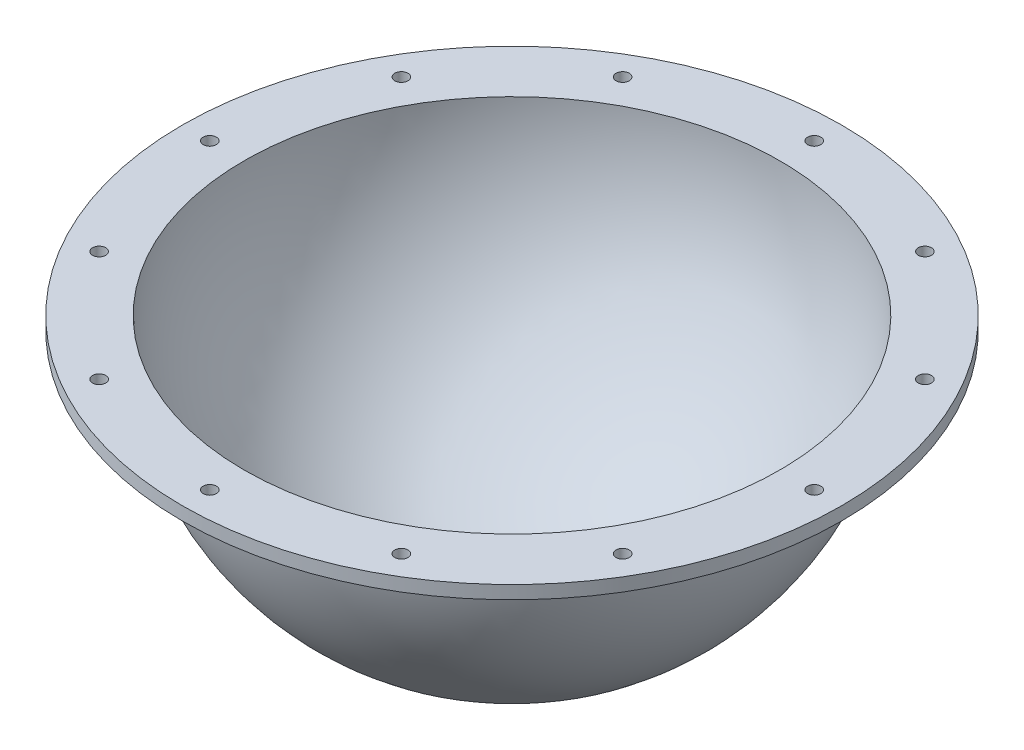
ISO-10303-21;
HEADER;
FILE_DESCRIPTION(('STEP AP214'),'2;1');
FILE_NAME('part.step','',(''),(''),'','','');
FILE_SCHEMA(('AUTOMOTIVE_DESIGN { 1 0 10303 214 1 1 1 1 }'));
ENDSEC;
DATA;
#1=APPLICATION_CONTEXT('core data for automotive mechanical design processes');
#2=APPLICATION_PROTOCOL_DEFINITION('international standard','automotive_design',2000,#1);
#3=PRODUCT_CONTEXT('',#1,'mechanical');
#4=PRODUCT('Part','Part','',(#3));
#5=PRODUCT_RELATED_PRODUCT_CATEGORY('part','',(#4));
#6=PRODUCT_DEFINITION_FORMATION('','',#4);
#7=PRODUCT_DEFINITION_CONTEXT('part definition',#1,'design');
#8=PRODUCT_DEFINITION('design','',#6,#7);
#9=PRODUCT_DEFINITION_SHAPE('','',#8);
#10=(LENGTH_UNIT() NAMED_UNIT(*) SI_UNIT(.MILLI.,.METRE.));
#11=(NAMED_UNIT(*) PLANE_ANGLE_UNIT() SI_UNIT($,.RADIAN.));
#12=(NAMED_UNIT(*) SI_UNIT($,.STERADIAN.) SOLID_ANGLE_UNIT());
#13=UNCERTAINTY_MEASURE_WITH_UNIT(LENGTH_MEASURE(1.E-05),#10,'distance_accuracy_value','');
#14=(GEOMETRIC_REPRESENTATION_CONTEXT(3) GLOBAL_UNCERTAINTY_ASSIGNED_CONTEXT((#13)) GLOBAL_UNIT_ASSIGNED_CONTEXT((#10,
#11,#12)) REPRESENTATION_CONTEXT('',''));
#15=CARTESIAN_POINT('',(0.,0.,0.));
#16=DIRECTION('',(0.,0.,1.));
#17=DIRECTION('',(1.,0.,0.));
#18=AXIS2_PLACEMENT_3D('',#15,#16,#17);
#19=CARTESIAN_POINT('',(1.59204083889156E-13,0.,0.));
#20=DIRECTION('',(0.,0.,-1.));
#21=DIRECTION('',(-1.,0.,0.));
#22=AXIS2_PLACEMENT_3D('',#19,#20,#21);
#23=SPHERICAL_SURFACE('',#22,243.75);
#24=CARTESIAN_POINT('',(1.59204083889156E-13,0.,0.));
#25=DIRECTION('',(0.,1.,0.));
#26=DIRECTION('',(0.,0.,1.));
#27=AXIS2_PLACEMENT_3D('',#24,#25,#26);
#28=SPHERICAL_SURFACE('',#27,243.75);
#29=CARTESIAN_POINT('',(1.59204083889156E-13,0.,0.));
#30=DIRECTION('',(0.,1.,0.));
#31=DIRECTION('',(0.,0.,1.));
#32=AXIS2_PLACEMENT_3D('',#29,#30,#31);
#33=CIRCLE('',#32,243.75);
#34=CARTESIAN_POINT('',(1.59204083889156E-13,0.,243.75));
#35=VERTEX_POINT('',#34);
#36=EDGE_CURVE('E10',#35,#35,#33,.T.);
#37=ORIENTED_EDGE('',*,*,#36,.T.);
#38=EDGE_LOOP('',(#37));
#39=FACE_BOUND('',#38,.T.);
#40=ADVANCED_FACE('F30',(#39),#28,.F.);
#41=CARTESIAN_POINT('',(1.59204083889156E-13,0.,0.));
#42=DIRECTION('',(0.,-1.,0.));
#43=DIRECTION('',(0.,0.,1.));
#44=AXIS2_PLACEMENT_3D('',#41,#42,#43);
#45=PLANE('',#44);
#46=CARTESIAN_POINT('',(0.,0.,-275.));
#47=DIRECTION('',(0.,1.,0.));
#48=DIRECTION('',(-1.,0.,0.));
#49=AXIS2_PLACEMENT_3D('',#46,#47,#48);
#50=CIRCLE('',#49,6.00000000000001);
#51=CARTESIAN_POINT('',(-6.00000000000001,0.,-275.));
#52=VERTEX_POINT('',#51);
#53=EDGE_CURVE('E51',#52,#52,#50,.T.);
#54=ORIENTED_EDGE('',*,*,#53,.F.);
#55=EDGE_LOOP('',(#54));
#56=FACE_BOUND('',#55,.T.);
#57=CARTESIAN_POINT('',(137.500000000001,9.60157368181865E-13,-238.156986040721));
#58=DIRECTION('',(0.,1.,0.));
#59=DIRECTION('',(-1.,0.,0.));
#60=AXIS2_PLACEMENT_3D('',#57,#58,#59);
#61=CIRCLE('',#60,6.00000000000002);
#62=CARTESIAN_POINT('',(131.500000000001,9.18259592115748E-13,-238.156986040721));
#63=VERTEX_POINT('',#62);
#64=EDGE_CURVE('E116',#63,#63,#61,.T.);
#65=ORIENTED_EDGE('',*,*,#64,.F.);
#66=EDGE_LOOP('',(#65));
#67=FACE_BOUND('',#66,.T.);
#68=CARTESIAN_POINT('',(238.156986040721,1.66304134495261E-12,-137.5));
#69=DIRECTION('',(0.,1.,0.));
#70=DIRECTION('',(-1.,0.,0.));
#71=AXIS2_PLACEMENT_3D('',#68,#69,#70);
#72=CIRCLE('',#71,5.99999999999999);
#73=CARTESIAN_POINT('',(232.156986040721,1.62114356888649E-12,-137.5));
#74=VERTEX_POINT('',#73);
#75=EDGE_CURVE('E119',#74,#74,#72,.T.);
#76=ORIENTED_EDGE('',*,*,#75,.F.);
#77=EDGE_LOOP('',(#76));
#78=FACE_BOUND('',#77,.T.);
#79=CARTESIAN_POINT('',(275.000000000001,1.92031473636373E-12,5.45708531560709E-13));
#80=DIRECTION('',(0.,1.,0.));
#81=DIRECTION('',(-1.,0.,0.));
#82=AXIS2_PLACEMENT_3D('',#79,#80,#81);
#83=CIRCLE('',#82,5.99999999999999);
#84=CARTESIAN_POINT('',(269.000000000001,1.87841696029761E-12,5.45708531560709E-13));
#85=VERTEX_POINT('',#84);
#86=EDGE_CURVE('E108',#85,#85,#83,.T.);
#87=ORIENTED_EDGE('',*,*,#86,.F.);
#88=EDGE_LOOP('',(#87));
#89=FACE_BOUND('',#88,.T.);
#90=CARTESIAN_POINT('',(-137.5,-9.60157368181864E-13,-238.156986040721));
#91=DIRECTION('',(0.,1.,0.));
#92=DIRECTION('',(-1.,0.,0.));
#93=AXIS2_PLACEMENT_3D('',#90,#91,#92);
#94=CIRCLE('',#93,5.99999999999999);
#95=CARTESIAN_POINT('',(-143.5,-1.00205514424798E-12,-238.156986040721));
#96=VERTEX_POINT('',#95);
#97=EDGE_CURVE('E101',#96,#96,#94,.T.);
#98=ORIENTED_EDGE('',*,*,#97,.F.);
#99=EDGE_LOOP('',(#98));
#100=FACE_BOUND('',#99,.T.);
#101=CARTESIAN_POINT('',(-238.156986040721,-1.6630413449526E-12,-137.5));
#102=DIRECTION('',(0.,1.,0.));
#103=DIRECTION('',(-1.,0.,0.));
#104=AXIS2_PLACEMENT_3D('',#101,#102,#103);
#105=CIRCLE('',#104,5.99999999999999);
#106=CARTESIAN_POINT('',(-244.156986040721,-1.70493912101872E-12,-137.5));
#107=VERTEX_POINT('',#106);
#108=EDGE_CURVE('E98',#107,#107,#105,.T.);
#109=ORIENTED_EDGE('',*,*,#108,.F.);
#110=EDGE_LOOP('',(#109));
#111=FACE_BOUND('',#110,.T.);
#112=CARTESIAN_POINT('',(-275.000000000001,-1.92031473636373E-12,6.67177904429211E-13));
#113=DIRECTION('',(0.,1.,0.));
#114=DIRECTION('',(-1.,0.,0.));
#115=AXIS2_PLACEMENT_3D('',#112,#113,#114);
#116=CIRCLE('',#115,5.99999999999999);
#117=CARTESIAN_POINT('',(-281.000000000001,-1.96221251242984E-12,6.67177904429211E-13));
#118=VERTEX_POINT('',#117);
#119=EDGE_CURVE('E94',#118,#118,#116,.T.);
#120=ORIENTED_EDGE('',*,*,#119,.F.);
#121=EDGE_LOOP('',(#120));
#122=FACE_BOUND('',#121,.T.);
#123=CARTESIAN_POINT('',(-238.156986040721,-1.6630413449526E-12,137.500000000001));
#124=DIRECTION('',(0.,1.,0.));
#125=DIRECTION('',(-1.,0.,0.));
#126=AXIS2_PLACEMENT_3D('',#123,#124,#125);
#127=CIRCLE('',#126,5.99999999999999);
#128=CARTESIAN_POINT('',(-244.156986040721,-1.70493912101872E-12,137.500000000001));
#129=VERTEX_POINT('',#128);
#130=EDGE_CURVE('E91',#129,#129,#127,.T.);
#131=ORIENTED_EDGE('',*,*,#130,.F.);
#132=EDGE_LOOP('',(#131));
#133=FACE_BOUND('',#132,.T.);
#134=CARTESIAN_POINT('',(-137.5,-9.60157368181863E-13,238.156986040722));
#135=DIRECTION('',(0.,1.,0.));
#136=DIRECTION('',(-1.,0.,0.));
#137=AXIS2_PLACEMENT_3D('',#134,#135,#136);
#138=CIRCLE('',#137,6.00000000000007);
#139=CARTESIAN_POINT('',(-143.5,-1.00205514424798E-12,238.156986040722));
#140=VERTEX_POINT('',#139);
#141=EDGE_CURVE('E95',#140,#140,#138,.T.);
#142=ORIENTED_EDGE('',*,*,#141,.F.);
#143=EDGE_LOOP('',(#142));
#144=FACE_BOUND('',#143,.T.);
#145=CARTESIAN_POINT('',(1.55147159845054E-13,0.,275.000000000001));
#146=DIRECTION('',(0.,1.,0.));
#147=DIRECTION('',(-1.,0.,0.));
#148=AXIS2_PLACEMENT_3D('',#145,#146,#147);
#149=CIRCLE('',#148,6.00000000000001);
#150=CARTESIAN_POINT('',(-5.99999999999985,0.,275.000000000001));
#151=VERTEX_POINT('',#150);
#152=EDGE_CURVE('E111',#151,#151,#149,.T.);
#153=ORIENTED_EDGE('',*,*,#152,.F.);
#154=EDGE_LOOP('',(#153));
#155=FACE_BOUND('',#154,.T.);
#156=CARTESIAN_POINT('',(137.5,9.60157368181864E-13,238.156986040722));
#157=DIRECTION('',(0.,1.,0.));
#158=DIRECTION('',(-1.,0.,0.));
#159=AXIS2_PLACEMENT_3D('',#156,#157,#158);
#160=CIRCLE('',#159,5.99999999999999);
#161=CARTESIAN_POINT('',(131.5,9.18259592115747E-13,238.156986040722));
#162=VERTEX_POINT('',#161);
#163=EDGE_CURVE('E107',#162,#162,#160,.T.);
#164=ORIENTED_EDGE('',*,*,#163,.F.);
#165=EDGE_LOOP('',(#164));
#166=FACE_BOUND('',#165,.T.);
#167=CARTESIAN_POINT('',(238.156986040721,1.66304134495261E-12,137.500000000001));
#168=DIRECTION('',(0.,1.,0.));
#169=DIRECTION('',(-1.,0.,0.));
#170=AXIS2_PLACEMENT_3D('',#167,#168,#169);
#171=CIRCLE('',#170,5.99999999999999);
#172=CARTESIAN_POINT('',(232.156986040721,1.62114356888649E-12,137.500000000001));
#173=VERTEX_POINT('',#172);
#174=EDGE_CURVE('E104',#173,#173,#171,.T.);
#175=ORIENTED_EDGE('',*,*,#174,.F.);
#176=EDGE_LOOP('',(#175));
#177=FACE_BOUND('',#176,.T.);
#178=ORIENTED_EDGE('',*,*,#36,.F.);
#179=EDGE_LOOP('',(#178));
#180=FACE_BOUND('',#179,.T.);
#181=CARTESIAN_POINT('',(0.,0.,0.));
#182=DIRECTION('',(0.,-1.,0.));
#183=DIRECTION('',(0.,0.,-1.));
#184=AXIS2_PLACEMENT_3D('',#181,#182,#183);
#185=CIRCLE('',#184,300.);
#186=CARTESIAN_POINT('',(0.,0.,-300.));
#187=VERTEX_POINT('',#186);
#188=EDGE_CURVE('E38',#187,#187,#185,.T.);
#189=ORIENTED_EDGE('',*,*,#188,.F.);
#190=EDGE_LOOP('',(#189));
#191=FACE_BOUND('',#190,.T.);
#192=ADVANCED_FACE('F130',(#56,#67,#78,#89,#100,#111,#122,#133,#144,#155,#166,#177,#180,#191),
#45,.F.);
#193=CARTESIAN_POINT('',(0.,0.,0.));
#194=DIRECTION('',(0.,-1.,0.));
#195=DIRECTION('',(0.,0.,-1.));
#196=AXIS2_PLACEMENT_3D('',#193,#194,#195);
#197=CYLINDRICAL_SURFACE('',#196,300.);
#198=CARTESIAN_POINT('',(0.,-12.,0.));
#199=DIRECTION('',(0.,-1.,0.));
#200=DIRECTION('',(0.,0.,-1.));
#201=AXIS2_PLACEMENT_3D('',#198,#199,#200);
#202=CIRCLE('',#201,300.);
#203=CARTESIAN_POINT('',(0.,-12.,-300.));
#204=VERTEX_POINT('',#203);
#205=EDGE_CURVE('E43',#204,#204,#202,.T.);
#206=ORIENTED_EDGE('',*,*,#205,.F.);
#207=EDGE_LOOP('',(#206));
#208=FACE_BOUND('',#207,.T.);
#209=ORIENTED_EDGE('',*,*,#188,.T.);
#210=EDGE_LOOP('',(#209));
#211=FACE_BOUND('',#210,.T.);
#212=ADVANCED_FACE('F133',(#208,#211),#197,.T.);
#213=CARTESIAN_POINT('',(0.,-12.,300.));
#214=DIRECTION('',(0.,1.,0.));
#215=DIRECTION('',(0.,0.,1.));
#216=AXIS2_PLACEMENT_3D('',#213,#214,#215);
#217=PLANE('',#216);
#218=CARTESIAN_POINT('',(0.,-12.,-275.));
#219=DIRECTION('',(0.,1.,0.));
#220=DIRECTION('',(0.,0.,1.));
#221=AXIS2_PLACEMENT_3D('',#218,#219,#220);
#222=CIRCLE('',#221,6.00000000000001);
#223=CARTESIAN_POINT('',(0.,-12.,-269.));
#224=VERTEX_POINT('',#223);
#225=EDGE_CURVE('E34',#224,#224,#222,.T.);
#226=ORIENTED_EDGE('',*,*,#225,.T.);
#227=EDGE_LOOP('',(#226));
#228=FACE_BOUND('',#227,.T.);
#229=CARTESIAN_POINT('',(137.500000000001,-12.,-238.156986040721));
#230=DIRECTION('',(0.,1.,0.));
#231=DIRECTION('',(0.,0.,1.));
#232=AXIS2_PLACEMENT_3D('',#229,#230,#231);
#233=CIRCLE('',#232,6.00000000000002);
#234=CARTESIAN_POINT('',(137.500000000001,-12.,-232.156986040721));
#235=VERTEX_POINT('',#234);
#236=EDGE_CURVE('E77',#235,#235,#233,.T.);
#237=ORIENTED_EDGE('',*,*,#236,.T.);
#238=EDGE_LOOP('',(#237));
#239=FACE_BOUND('',#238,.T.);
#240=CARTESIAN_POINT('',(238.156986040721,-12.,-137.5));
#241=DIRECTION('',(0.,1.,0.));
#242=DIRECTION('',(0.,0.,1.));
#243=AXIS2_PLACEMENT_3D('',#240,#241,#242);
#244=CIRCLE('',#243,5.99999999999999);
#245=CARTESIAN_POINT('',(238.156986040721,-12.,-131.5));
#246=VERTEX_POINT('',#245);
#247=EDGE_CURVE('E75',#246,#246,#244,.T.);
#248=ORIENTED_EDGE('',*,*,#247,.T.);
#249=EDGE_LOOP('',(#248));
#250=FACE_BOUND('',#249,.T.);
#251=CARTESIAN_POINT('',(275.000000000001,-12.,5.45708531560709E-13));
#252=DIRECTION('',(0.,1.,0.));
#253=DIRECTION('',(0.,0.,1.));
#254=AXIS2_PLACEMENT_3D('',#251,#252,#253);
#255=CIRCLE('',#254,5.99999999999999);
#256=CARTESIAN_POINT('',(275.000000000001,-12.,6.00000000000054));
#257=VERTEX_POINT('',#256);
#258=EDGE_CURVE('E72',#257,#257,#255,.T.);
#259=ORIENTED_EDGE('',*,*,#258,.T.);
#260=EDGE_LOOP('',(#259));
#261=FACE_BOUND('',#260,.T.);
#262=CARTESIAN_POINT('',(-137.5,-12.,-238.156986040721));
#263=DIRECTION('',(0.,1.,0.));
#264=DIRECTION('',(0.,0.,1.));
#265=AXIS2_PLACEMENT_3D('',#262,#263,#264);
#266=CIRCLE('',#265,5.99999999999999);
#267=CARTESIAN_POINT('',(-137.5,-12.,-232.156986040721));
#268=VERTEX_POINT('',#267);
#269=EDGE_CURVE('E69',#268,#268,#266,.T.);
#270=ORIENTED_EDGE('',*,*,#269,.T.);
#271=EDGE_LOOP('',(#270));
#272=FACE_BOUND('',#271,.T.);
#273=CARTESIAN_POINT('',(-238.156986040721,-12.,-137.5));
#274=DIRECTION('',(0.,1.,0.));
#275=DIRECTION('',(0.,0.,1.));
#276=AXIS2_PLACEMENT_3D('',#273,#274,#275);
#277=CIRCLE('',#276,5.99999999999999);
#278=CARTESIAN_POINT('',(-238.156986040721,-12.,-131.5));
#279=VERTEX_POINT('',#278);
#280=EDGE_CURVE('E66',#279,#279,#277,.T.);
#281=ORIENTED_EDGE('',*,*,#280,.T.);
#282=EDGE_LOOP('',(#281));
#283=FACE_BOUND('',#282,.T.);
#284=CARTESIAN_POINT('',(-275.,-12.,6.67177904429211E-13));
#285=DIRECTION('',(0.,1.,0.));
#286=DIRECTION('',(0.,0.,1.));
#287=AXIS2_PLACEMENT_3D('',#284,#285,#286);
#288=CIRCLE('',#287,5.99999999999999);
#289=CARTESIAN_POINT('',(-275.,-12.,6.00000000000066));
#290=VERTEX_POINT('',#289);
#291=EDGE_CURVE('E63',#290,#290,#288,.T.);
#292=ORIENTED_EDGE('',*,*,#291,.T.);
#293=EDGE_LOOP('',(#292));
#294=FACE_BOUND('',#293,.T.);
#295=CARTESIAN_POINT('',(-238.156986040721,-12.,137.500000000001));
#296=DIRECTION('',(0.,1.,0.));
#297=DIRECTION('',(0.,0.,1.));
#298=AXIS2_PLACEMENT_3D('',#295,#296,#297);
#299=CIRCLE('',#298,5.99999999999999);
#300=CARTESIAN_POINT('',(-238.156986040721,-12.,143.500000000001));
#301=VERTEX_POINT('',#300);
#302=EDGE_CURVE('E60',#301,#301,#299,.T.);
#303=ORIENTED_EDGE('',*,*,#302,.T.);
#304=EDGE_LOOP('',(#303));
#305=FACE_BOUND('',#304,.T.);
#306=CARTESIAN_POINT('',(-137.5,-12.,238.156986040722));
#307=DIRECTION('',(0.,1.,0.));
#308=DIRECTION('',(0.,0.,1.));
#309=AXIS2_PLACEMENT_3D('',#306,#307,#308);
#310=CIRCLE('',#309,6.00000000000007);
#311=CARTESIAN_POINT('',(-137.5,-12.,244.156986040722));
#312=VERTEX_POINT('',#311);
#313=EDGE_CURVE('E57',#312,#312,#310,.T.);
#314=ORIENTED_EDGE('',*,*,#313,.T.);
#315=EDGE_LOOP('',(#314));
#316=FACE_BOUND('',#315,.T.);
#317=CARTESIAN_POINT('',(2.3894271197729E-13,-12.,275.000000000001));
#318=DIRECTION('',(0.,1.,0.));
#319=DIRECTION('',(0.,0.,1.));
#320=AXIS2_PLACEMENT_3D('',#317,#318,#319);
#321=CIRCLE('',#320,6.00000000000001);
#322=CARTESIAN_POINT('',(2.3894271197729E-13,-12.,281.000000000001));
#323=VERTEX_POINT('',#322);
#324=EDGE_CURVE('E54',#323,#323,#321,.T.);
#325=ORIENTED_EDGE('',*,*,#324,.T.);
#326=EDGE_LOOP('',(#325));
#327=FACE_BOUND('',#326,.T.);
#328=CARTESIAN_POINT('',(137.5,-12.,238.156986040722));
#329=DIRECTION('',(0.,1.,0.));
#330=DIRECTION('',(0.,0.,1.));
#331=AXIS2_PLACEMENT_3D('',#328,#329,#330);
#332=CIRCLE('',#331,5.99999999999999);
#333=CARTESIAN_POINT('',(137.5,-12.,244.156986040722));
#334=VERTEX_POINT('',#333);
#335=EDGE_CURVE('E50',#334,#334,#332,.T.);
#336=ORIENTED_EDGE('',*,*,#335,.T.);
#337=EDGE_LOOP('',(#336));
#338=FACE_BOUND('',#337,.T.);
#339=CARTESIAN_POINT('',(238.156986040721,-12.,137.500000000001));
#340=DIRECTION('',(0.,1.,0.));
#341=DIRECTION('',(0.,0.,1.));
#342=AXIS2_PLACEMENT_3D('',#339,#340,#341);
#343=CIRCLE('',#342,5.99999999999999);
#344=CARTESIAN_POINT('',(238.156986040721,-12.,143.500000000001));
#345=VERTEX_POINT('',#344);
#346=EDGE_CURVE('E47',#345,#345,#343,.T.);
#347=ORIENTED_EDGE('',*,*,#346,.T.);
#348=EDGE_LOOP('',(#347));
#349=FACE_BOUND('',#348,.T.);
#350=CARTESIAN_POINT('',(0.,-12.,0.));
#351=DIRECTION('',(0.,-1.,0.));
#352=DIRECTION('',(0.,0.,-1.));
#353=AXIS2_PLACEMENT_3D('',#350,#351,#352);
#354=CIRCLE('',#353,249.711833920621);
#355=CARTESIAN_POINT('',(0.,-12.,-249.711833920621));
#356=VERTEX_POINT('',#355);
#357=EDGE_CURVE('E82',#356,#356,#354,.T.);
#358=ORIENTED_EDGE('',*,*,#357,.F.);
#359=EDGE_LOOP('',(#358));
#360=FACE_BOUND('',#359,.T.);
#361=ORIENTED_EDGE('',*,*,#205,.T.);
#362=EDGE_LOOP('',(#361));
#363=FACE_BOUND('',#362,.T.);
#364=ADVANCED_FACE('F161',(#228,#239,#250,#261,#272,#283,#294,#305,#316,#327,#338,#349,#360,
#363),#217,.F.);
#365=CARTESIAN_POINT('',(1.59204083889156E-13,0.,0.));
#366=DIRECTION('',(0.,0.,-1.));
#367=DIRECTION('',(-1.,0.,0.));
#368=AXIS2_PLACEMENT_3D('',#365,#366,#367);
#369=SPHERICAL_SURFACE('',#368,250.);
#370=CARTESIAN_POINT('',(1.59204083889156E-13,0.,0.));
#371=DIRECTION('',(0.,-1.,0.));
#372=DIRECTION('',(0.,0.,-1.));
#373=AXIS2_PLACEMENT_3D('',#370,#371,#372);
#374=SPHERICAL_SURFACE('',#373,250.);
#375=ORIENTED_EDGE('',*,*,#357,.T.);
#376=EDGE_LOOP('',(#375));
#377=FACE_BOUND('',#376,.T.);
#378=ADVANCED_FACE('F32',(#377),#374,.T.);
#379=CARTESIAN_POINT('',(238.156986040723,-250.,137.500000000001));
#380=DIRECTION('',(0.,1.,0.));
#381=DIRECTION('',(-1.,0.,0.));
#382=AXIS2_PLACEMENT_3D('',#379,#380,#381);
#383=CYLINDRICAL_SURFACE('',#382,5.99999999999999);
#384=ORIENTED_EDGE('',*,*,#174,.T.);
#385=EDGE_LOOP('',(#384));
#386=FACE_BOUND('',#385,.T.);
#387=ORIENTED_EDGE('',*,*,#346,.F.);
#388=EDGE_LOOP('',(#387));
#389=FACE_BOUND('',#388,.T.);
#390=ADVANCED_FACE('F194',(#386,#389),#383,.F.);
#391=CARTESIAN_POINT('',(137.500000000002,-250.000000000001,238.156986040722));
#392=DIRECTION('',(0.,1.,0.));
#393=DIRECTION('',(-1.,0.,0.));
#394=AXIS2_PLACEMENT_3D('',#391,#392,#393);
#395=CYLINDRICAL_SURFACE('',#394,5.99999999999999);
#396=ORIENTED_EDGE('',*,*,#163,.T.);
#397=EDGE_LOOP('',(#396));
#398=FACE_BOUND('',#397,.T.);
#399=ORIENTED_EDGE('',*,*,#335,.F.);
#400=EDGE_LOOP('',(#399));
#401=FACE_BOUND('',#400,.T.);
#402=ADVANCED_FACE('F198',(#398,#401),#395,.F.);
#403=CARTESIAN_POINT('',(1.90088782926664E-12,-250.000000000002,275.000000000001));
#404=DIRECTION('',(0.,1.,0.));
#405=DIRECTION('',(-1.,0.,0.));
#406=AXIS2_PLACEMENT_3D('',#403,#404,#405);
#407=CYLINDRICAL_SURFACE('',#406,6.00000000000001);
#408=ORIENTED_EDGE('',*,*,#152,.T.);
#409=EDGE_LOOP('',(#408));
#410=FACE_BOUND('',#409,.T.);
#411=ORIENTED_EDGE('',*,*,#324,.F.);
#412=EDGE_LOOP('',(#411));
#413=FACE_BOUND('',#412,.T.);
#414=ADVANCED_FACE('F208',(#410,#413),#407,.F.);
#415=CARTESIAN_POINT('',(-137.499999999998,-250.000000000003,238.156986040722));
#416=DIRECTION('',(0.,1.,0.));
#417=DIRECTION('',(-1.,0.,0.));
#418=AXIS2_PLACEMENT_3D('',#415,#416,#417);
#419=CYLINDRICAL_SURFACE('',#418,6.00000000000007);
#420=ORIENTED_EDGE('',*,*,#141,.T.);
#421=EDGE_LOOP('',(#420));
#422=FACE_BOUND('',#421,.T.);
#423=ORIENTED_EDGE('',*,*,#313,.F.);
#424=EDGE_LOOP('',(#423));
#425=FACE_BOUND('',#424,.T.);
#426=ADVANCED_FACE('F218',(#422,#425),#419,.F.);
#427=CARTESIAN_POINT('',(-238.156986040719,-250.000000000004,137.500000000001));
#428=DIRECTION('',(0.,1.,0.));
#429=DIRECTION('',(-1.,0.,0.));
#430=AXIS2_PLACEMENT_3D('',#427,#428,#429);
#431=CYLINDRICAL_SURFACE('',#430,5.99999999999999);
#432=ORIENTED_EDGE('',*,*,#130,.T.);
#433=EDGE_LOOP('',(#432));
#434=FACE_BOUND('',#433,.T.);
#435=ORIENTED_EDGE('',*,*,#302,.F.);
#436=EDGE_LOOP('',(#435));
#437=FACE_BOUND('',#436,.T.);
#438=ADVANCED_FACE('F228',(#434,#437),#431,.F.);
#439=CARTESIAN_POINT('',(-274.999999999999,-250.000000000004,6.67177904429211E-13));
#440=DIRECTION('',(0.,1.,0.));
#441=DIRECTION('',(-1.,0.,0.));
#442=AXIS2_PLACEMENT_3D('',#439,#440,#441);
#443=CYLINDRICAL_SURFACE('',#442,5.99999999999999);
#444=ORIENTED_EDGE('',*,*,#119,.T.);
#445=EDGE_LOOP('',(#444));
#446=FACE_BOUND('',#445,.T.);
#447=ORIENTED_EDGE('',*,*,#291,.F.);
#448=EDGE_LOOP('',(#447));
#449=FACE_BOUND('',#448,.T.);
#450=ADVANCED_FACE('F238',(#446,#449),#443,.F.);
#451=CARTESIAN_POINT('',(-238.156986040719,-250.000000000004,-137.5));
#452=DIRECTION('',(0.,1.,0.));
#453=DIRECTION('',(-1.,0.,0.));
#454=AXIS2_PLACEMENT_3D('',#451,#452,#453);
#455=CYLINDRICAL_SURFACE('',#454,5.99999999999999);
#456=ORIENTED_EDGE('',*,*,#108,.T.);
#457=EDGE_LOOP('',(#456));
#458=FACE_BOUND('',#457,.T.);
#459=ORIENTED_EDGE('',*,*,#280,.F.);
#460=EDGE_LOOP('',(#459));
#461=FACE_BOUND('',#460,.T.);
#462=ADVANCED_FACE('F248',(#458,#461),#455,.F.);
#463=CARTESIAN_POINT('',(-137.499999999999,-250.000000000003,-238.156986040721));
#464=DIRECTION('',(0.,1.,0.));
#465=DIRECTION('',(-1.,0.,0.));
#466=AXIS2_PLACEMENT_3D('',#463,#464,#465);
#467=CYLINDRICAL_SURFACE('',#466,5.99999999999999);
#468=ORIENTED_EDGE('',*,*,#97,.T.);
#469=EDGE_LOOP('',(#468));
#470=FACE_BOUND('',#469,.T.);
#471=ORIENTED_EDGE('',*,*,#269,.F.);
#472=EDGE_LOOP('',(#471));
#473=FACE_BOUND('',#472,.T.);
#474=ADVANCED_FACE('F258',(#470,#473),#467,.F.);
#475=CARTESIAN_POINT('',(275.000000000002,-250.,5.45708531560709E-13));
#476=DIRECTION('',(0.,1.,0.));
#477=DIRECTION('',(-1.,0.,0.));
#478=AXIS2_PLACEMENT_3D('',#475,#476,#477);
#479=CYLINDRICAL_SURFACE('',#478,5.99999999999999);
#480=ORIENTED_EDGE('',*,*,#86,.T.);
#481=EDGE_LOOP('',(#480));
#482=FACE_BOUND('',#481,.T.);
#483=ORIENTED_EDGE('',*,*,#258,.F.);
#484=EDGE_LOOP('',(#483));
#485=FACE_BOUND('',#484,.T.);
#486=ADVANCED_FACE('F268',(#482,#485),#479,.F.);
#487=CARTESIAN_POINT('',(238.156986040723,-250.,-137.5));
#488=DIRECTION('',(0.,1.,0.));
#489=DIRECTION('',(-1.,0.,0.));
#490=AXIS2_PLACEMENT_3D('',#487,#488,#489);
#491=CYLINDRICAL_SURFACE('',#490,5.99999999999999);
#492=ORIENTED_EDGE('',*,*,#75,.T.);
#493=EDGE_LOOP('',(#492));
#494=FACE_BOUND('',#493,.T.);
#495=ORIENTED_EDGE('',*,*,#247,.F.);
#496=EDGE_LOOP('',(#495));
#497=FACE_BOUND('',#496,.T.);
#498=ADVANCED_FACE('F278',(#494,#497),#491,.F.);
#499=CARTESIAN_POINT('',(137.500000000002,-250.000000000001,-238.156986040721));
#500=DIRECTION('',(0.,1.,0.));
#501=DIRECTION('',(-1.,0.,0.));
#502=AXIS2_PLACEMENT_3D('',#499,#500,#501);
#503=CYLINDRICAL_SURFACE('',#502,6.00000000000002);
#504=ORIENTED_EDGE('',*,*,#64,.T.);
#505=EDGE_LOOP('',(#504));
#506=FACE_BOUND('',#505,.T.);
#507=ORIENTED_EDGE('',*,*,#236,.F.);
#508=EDGE_LOOP('',(#507));
#509=FACE_BOUND('',#508,.T.);
#510=ADVANCED_FACE('F288',(#506,#509),#503,.F.);
#511=CARTESIAN_POINT('',(1.74574066942158E-12,-250.000000000002,-275.));
#512=DIRECTION('',(0.,1.,0.));
#513=DIRECTION('',(-1.,0.,0.));
#514=AXIS2_PLACEMENT_3D('',#511,#512,#513);
#515=CYLINDRICAL_SURFACE('',#514,6.00000000000001);
#516=ORIENTED_EDGE('',*,*,#53,.T.);
#517=EDGE_LOOP('',(#516));
#518=FACE_BOUND('',#517,.T.);
#519=ORIENTED_EDGE('',*,*,#225,.F.);
#520=EDGE_LOOP('',(#519));
#521=FACE_BOUND('',#520,.T.);
#522=ADVANCED_FACE('F127',(#518,#521),#515,.F.);
#523=CLOSED_SHELL('',(#40,#192,#212,#364,#378,#390,#402,#414,#426,#438,#450,#462,#474,#486,#498,
#510,#522));
#524=MANIFOLD_SOLID_BREP('B2',#523);
#525=ADVANCED_BREP_SHAPE_REPRESENTATION('',(#18,#524),#14);
#526=SHAPE_DEFINITION_REPRESENTATION(#9,#525);
ENDSEC;
END-ISO-10303-21;
